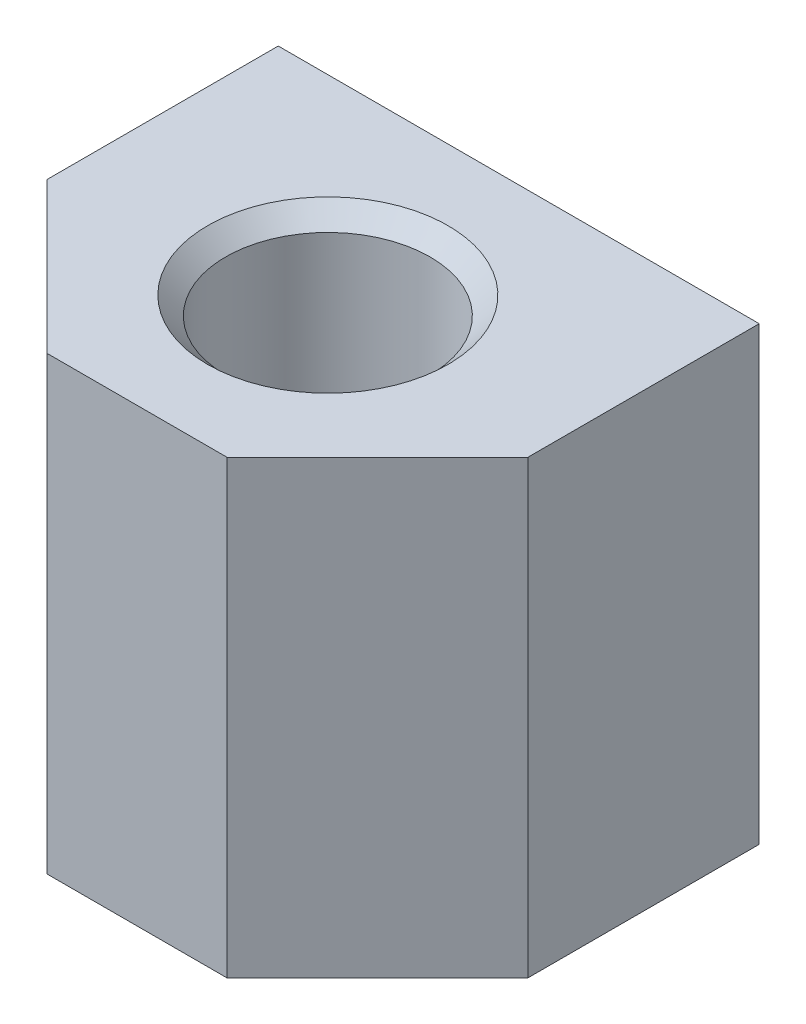
ISO-10303-21;
HEADER;
FILE_DESCRIPTION(('STEP AP214'),'2;1');
FILE_NAME('part.step','',(''),(''),'','','');
FILE_SCHEMA(('AUTOMOTIVE_DESIGN { 1 0 10303 214 1 1 1 1 }'));
ENDSEC;
DATA;
#1=APPLICATION_CONTEXT('core data for automotive mechanical design processes');
#2=APPLICATION_PROTOCOL_DEFINITION('international standard','automotive_design',2000,#1);
#3=PRODUCT_CONTEXT('',#1,'mechanical');
#4=PRODUCT('Part','Part','',(#3));
#5=PRODUCT_RELATED_PRODUCT_CATEGORY('part','',(#4));
#6=PRODUCT_DEFINITION_FORMATION('','',#4);
#7=PRODUCT_DEFINITION_CONTEXT('part definition',#1,'design');
#8=PRODUCT_DEFINITION('design','',#6,#7);
#9=PRODUCT_DEFINITION_SHAPE('','',#8);
#10=(LENGTH_UNIT() NAMED_UNIT(*) SI_UNIT(.MILLI.,.METRE.));
#11=(NAMED_UNIT(*) PLANE_ANGLE_UNIT() SI_UNIT($,.RADIAN.));
#12=(NAMED_UNIT(*) SI_UNIT($,.STERADIAN.) SOLID_ANGLE_UNIT());
#13=UNCERTAINTY_MEASURE_WITH_UNIT(LENGTH_MEASURE(1.E-05),#10,'distance_accuracy_value','');
#14=(GEOMETRIC_REPRESENTATION_CONTEXT(3) GLOBAL_UNCERTAINTY_ASSIGNED_CONTEXT((#13)) GLOBAL_UNIT_ASSIGNED_CONTEXT((#10,
#11,#12)) REPRESENTATION_CONTEXT('',''));
#15=CARTESIAN_POINT('',(0.,0.,0.));
#16=DIRECTION('',(0.,0.,1.));
#17=DIRECTION('',(1.,0.,0.));
#18=AXIS2_PLACEMENT_3D('',#15,#16,#17);
#19=CARTESIAN_POINT('',(-8.,7.5,-6.35));
#20=DIRECTION('',(1.,0.,0.));
#21=DIRECTION('',(0.,0.,-1.));
#22=AXIS2_PLACEMENT_3D('',#19,#20,#21);
#23=PLANE('',#22);
#24=DIRECTION('',(0.,0.,1.));
#25=VECTOR('',#24,1.);
#26=CARTESIAN_POINT('',(-8.,-7.5,-6.35));
#27=LINE('',#26,#25);
#28=CARTESIAN_POINT('',(-8.,-7.5,-6.35));
#29=VERTEX_POINT('',#28);
#30=CARTESIAN_POINT('',(-8.,-7.5,1.34999999999999));
#31=VERTEX_POINT('',#30);
#32=EDGE_CURVE('E136',#29,#31,#27,.T.);
#33=ORIENTED_EDGE('',*,*,#32,.T.);
#34=DIRECTION('',(0.,1.,0.));
#35=VECTOR('',#34,1.);
#36=CARTESIAN_POINT('',(-8.,7.5,1.34999999999999));
#37=LINE('',#36,#35);
#38=CARTESIAN_POINT('',(-8.,7.5,1.34999999999998));
#39=VERTEX_POINT('',#38);
#40=EDGE_CURVE('E61',#31,#39,#37,.T.);
#41=ORIENTED_EDGE('',*,*,#40,.T.);
#42=DIRECTION('',(0.,0.,1.));
#43=VECTOR('',#42,1.);
#44=CARTESIAN_POINT('',(-8.,7.5,-6.35));
#45=LINE('',#44,#43);
#46=CARTESIAN_POINT('',(-8.,7.5,-6.35));
#47=VERTEX_POINT('',#46);
#48=EDGE_CURVE('E137',#47,#39,#45,.T.);
#49=ORIENTED_EDGE('',*,*,#48,.F.);
#50=DIRECTION('',(0.,-1.,0.));
#51=VECTOR('',#50,1.);
#52=CARTESIAN_POINT('',(-8.,7.5,-6.35));
#53=LINE('',#52,#51);
#54=EDGE_CURVE('E146',#47,#29,#53,.T.);
#55=ORIENTED_EDGE('',*,*,#54,.T.);
#56=EDGE_LOOP('',(#33,#41,#49,#55));
#57=FACE_BOUND('',#56,.T.);
#58=ADVANCED_FACE('F38',(#57),#23,.F.);
#59=CARTESIAN_POINT('',(8.,7.5,6.35));
#60=DIRECTION('',(0.,0.,-1.));
#61=DIRECTION('',(-1.,0.,0.));
#62=AXIS2_PLACEMENT_3D('',#59,#60,#61);
#63=PLANE('',#62);
#64=DIRECTION('',(1.,0.,0.));
#65=VECTOR('',#64,1.);
#66=CARTESIAN_POINT('',(8.,7.5,6.35));
#67=LINE('',#66,#65);
#68=CARTESIAN_POINT('',(-3.,7.5,6.35));
#69=VERTEX_POINT('',#68);
#70=CARTESIAN_POINT('',(2.99999999999999,7.5,6.35));
#71=VERTEX_POINT('',#70);
#72=EDGE_CURVE('E139',#69,#71,#67,.T.);
#73=ORIENTED_EDGE('',*,*,#72,.F.);
#74=DIRECTION('',(0.,-1.,0.));
#75=VECTOR('',#74,1.);
#76=CARTESIAN_POINT('',(-3.,7.5,6.35));
#77=LINE('',#76,#75);
#78=CARTESIAN_POINT('',(-3.,-7.5,6.35));
#79=VERTEX_POINT('',#78);
#80=EDGE_CURVE('E161',#69,#79,#77,.T.);
#81=ORIENTED_EDGE('',*,*,#80,.T.);
#82=DIRECTION('',(1.,0.,0.));
#83=VECTOR('',#82,1.);
#84=CARTESIAN_POINT('',(8.,-7.5,6.35));
#85=LINE('',#84,#83);
#86=CARTESIAN_POINT('',(2.99999999999999,-7.5,6.35));
#87=VERTEX_POINT('',#86);
#88=EDGE_CURVE('E148',#79,#87,#85,.T.);
#89=ORIENTED_EDGE('',*,*,#88,.T.);
#90=DIRECTION('',(0.,1.,0.));
#91=VECTOR('',#90,1.);
#92=CARTESIAN_POINT('',(2.99999999999999,7.5,6.35));
#93=LINE('',#92,#91);
#94=EDGE_CURVE('E159',#87,#71,#93,.T.);
#95=ORIENTED_EDGE('',*,*,#94,.T.);
#96=EDGE_LOOP('',(#73,#81,#89,#95));
#97=FACE_BOUND('',#96,.T.);
#98=ADVANCED_FACE('F175',(#97),#63,.F.);
#99=CARTESIAN_POINT('',(8.,7.5,-6.35));
#100=DIRECTION('',(-1.,0.,0.));
#101=DIRECTION('',(0.,0.,1.));
#102=AXIS2_PLACEMENT_3D('',#99,#100,#101);
#103=PLANE('',#102);
#104=DIRECTION('',(0.,0.,-1.));
#105=VECTOR('',#104,1.);
#106=CARTESIAN_POINT('',(8.,7.5,-6.35));
#107=LINE('',#106,#105);
#108=CARTESIAN_POINT('',(8.,7.5,1.35));
#109=VERTEX_POINT('',#108);
#110=CARTESIAN_POINT('',(8.,7.5,-6.35));
#111=VERTEX_POINT('',#110);
#112=EDGE_CURVE('E142',#109,#111,#107,.T.);
#113=ORIENTED_EDGE('',*,*,#112,.F.);
#114=DIRECTION('',(0.,-1.,0.));
#115=VECTOR('',#114,1.);
#116=CARTESIAN_POINT('',(8.,7.5,1.35));
#117=LINE('',#116,#115);
#118=CARTESIAN_POINT('',(8.,-7.5,1.35));
#119=VERTEX_POINT('',#118);
#120=EDGE_CURVE('E11',#109,#119,#117,.T.);
#121=ORIENTED_EDGE('',*,*,#120,.T.);
#122=DIRECTION('',(0.,0.,-1.));
#123=VECTOR('',#122,1.);
#124=CARTESIAN_POINT('',(8.,-7.5,-6.35));
#125=LINE('',#124,#123);
#126=CARTESIAN_POINT('',(8.,-7.5,-6.35));
#127=VERTEX_POINT('',#126);
#128=EDGE_CURVE('E151',#119,#127,#125,.T.);
#129=ORIENTED_EDGE('',*,*,#128,.T.);
#130=DIRECTION('',(0.,-1.,0.));
#131=VECTOR('',#130,1.);
#132=CARTESIAN_POINT('',(8.,7.5,-6.35));
#133=LINE('',#132,#131);
#134=EDGE_CURVE('E156',#111,#127,#133,.T.);
#135=ORIENTED_EDGE('',*,*,#134,.F.);
#136=EDGE_LOOP('',(#113,#121,#129,#135));
#137=FACE_BOUND('',#136,.T.);
#138=ADVANCED_FACE('F190',(#137),#103,.F.);
#139=CARTESIAN_POINT('',(-3.66617420935413,7.5,-6.35));
#140=DIRECTION('',(0.,0.,1.));
#141=DIRECTION('',(1.,0.,0.));
#142=AXIS2_PLACEMENT_3D('',#139,#140,#141);
#143=PLANE('',#142);
#144=CARTESIAN_POINT('',(6.,0.,-6.35));
#145=DIRECTION('',(0.,0.,-1.));
#146=DIRECTION('',(-1.,0.,0.));
#147=AXIS2_PLACEMENT_3D('',#144,#145,#146);
#148=CIRCLE('',#147,1.525);
#149=CARTESIAN_POINT('',(4.475,0.,-6.35));
#150=VERTEX_POINT('',#149);
#151=EDGE_CURVE('E115',#150,#150,#148,.T.);
#152=ORIENTED_EDGE('',*,*,#151,.F.);
#153=EDGE_LOOP('',(#152));
#154=FACE_BOUND('',#153,.T.);
#155=CARTESIAN_POINT('',(-6.,0.,-6.35));
#156=DIRECTION('',(0.,0.,-1.));
#157=DIRECTION('',(-1.,0.,0.));
#158=AXIS2_PLACEMENT_3D('',#155,#156,#157);
#159=CIRCLE('',#158,1.525);
#160=CARTESIAN_POINT('',(-7.525,0.,-6.35));
#161=VERTEX_POINT('',#160);
#162=EDGE_CURVE('E108',#161,#161,#159,.T.);
#163=ORIENTED_EDGE('',*,*,#162,.F.);
#164=EDGE_LOOP('',(#163));
#165=FACE_BOUND('',#164,.T.);
#166=DIRECTION('',(-1.,0.,0.));
#167=VECTOR('',#166,1.);
#168=CARTESIAN_POINT('',(-3.66617420935413,-7.5,-6.35));
#169=LINE('',#168,#167);
#170=EDGE_CURVE('E140',#127,#29,#169,.T.);
#171=ORIENTED_EDGE('',*,*,#170,.T.);
#172=ORIENTED_EDGE('',*,*,#54,.F.);
#173=DIRECTION('',(-1.,0.,0.));
#174=VECTOR('',#173,1.);
#175=CARTESIAN_POINT('',(3.66617420935413,7.5,-6.35));
#176=LINE('',#175,#174);
#177=EDGE_CURVE('E144',#111,#47,#176,.T.);
#178=ORIENTED_EDGE('',*,*,#177,.F.);
#179=ORIENTED_EDGE('',*,*,#134,.T.);
#180=EDGE_LOOP('',(#171,#172,#178,#179));
#181=FACE_BOUND('',#180,.T.);
#182=ADVANCED_FACE('F186',(#154,#165,#181),#143,.F.);
#183=CARTESIAN_POINT('',(0.,7.5,0.));
#184=DIRECTION('',(0.,-1.,0.));
#185=DIRECTION('',(0.,0.,-1.));
#186=AXIS2_PLACEMENT_3D('',#183,#184,#185);
#187=PLANE('',#186);
#188=CARTESIAN_POINT('',(0.,7.5,0.));
#189=DIRECTION('',(0.,1.,0.));
#190=DIRECTION('',(0.,0.,1.));
#191=AXIS2_PLACEMENT_3D('',#188,#189,#190);
#192=CIRCLE('',#191,4.);
#193=CARTESIAN_POINT('',(0.,7.5,4.));
#194=VERTEX_POINT('',#193);
#195=EDGE_CURVE('E127',#194,#194,#192,.T.);
#196=ORIENTED_EDGE('',*,*,#195,.F.);
#197=EDGE_LOOP('',(#196));
#198=FACE_BOUND('',#197,.T.);
#199=ORIENTED_EDGE('',*,*,#48,.T.);
#200=DIRECTION('',(-0.707106781186546,0.,-0.707106781186549));
#201=VECTOR('',#200,1.);
#202=CARTESIAN_POINT('',(-3.,7.5,6.35));
#203=LINE('',#202,#201);
#204=EDGE_CURVE('E46',#39,#69,#203,.F.);
#205=ORIENTED_EDGE('',*,*,#204,.T.);
#206=ORIENTED_EDGE('',*,*,#72,.T.);
#207=DIRECTION('',(-0.707106781186549,0.,0.707106781186546));
#208=VECTOR('',#207,1.);
#209=CARTESIAN_POINT('',(8.,7.5,1.35));
#210=LINE('',#209,#208);
#211=EDGE_CURVE('E53',#71,#109,#210,.F.);
#212=ORIENTED_EDGE('',*,*,#211,.T.);
#213=ORIENTED_EDGE('',*,*,#112,.T.);
#214=ORIENTED_EDGE('',*,*,#177,.T.);
#215=EDGE_LOOP('',(#199,#205,#206,#212,#213,#214));
#216=FACE_BOUND('',#215,.T.);
#217=ADVANCED_FACE('F171',(#198,#216),#187,.F.);
#218=CARTESIAN_POINT('',(0.,-7.5,0.));
#219=DIRECTION('',(0.,-1.,0.));
#220=DIRECTION('',(0.,0.,-1.));
#221=AXIS2_PLACEMENT_3D('',#218,#219,#220);
#222=PLANE('',#221);
#223=CARTESIAN_POINT('',(0.,-7.5,0.));
#224=DIRECTION('',(0.,1.,0.));
#225=DIRECTION('',(0.,0.,1.));
#226=AXIS2_PLACEMENT_3D('',#223,#224,#225);
#227=CIRCLE('',#226,4.);
#228=CARTESIAN_POINT('',(0.,-7.5,4.));
#229=VERTEX_POINT('',#228);
#230=EDGE_CURVE('E124',#229,#229,#227,.T.);
#231=ORIENTED_EDGE('',*,*,#230,.T.);
#232=EDGE_LOOP('',(#231));
#233=FACE_BOUND('',#232,.T.);
#234=ORIENTED_EDGE('',*,*,#88,.F.);
#235=DIRECTION('',(0.707106781186546,0.,0.707106781186549));
#236=VECTOR('',#235,1.);
#237=CARTESIAN_POINT('',(-4.67500000000001,-7.5,4.67499999999999));
#238=LINE('',#237,#236);
#239=EDGE_CURVE('E166',#79,#31,#238,.F.);
#240=ORIENTED_EDGE('',*,*,#239,.T.);
#241=ORIENTED_EDGE('',*,*,#32,.F.);
#242=ORIENTED_EDGE('',*,*,#170,.F.);
#243=ORIENTED_EDGE('',*,*,#128,.F.);
#244=DIRECTION('',(0.707106781186549,0.,-0.707106781186546));
#245=VECTOR('',#244,1.);
#246=CARTESIAN_POINT('',(4.67499999999999,-7.5,4.675));
#247=LINE('',#246,#245);
#248=EDGE_CURVE('E164',#119,#87,#247,.F.);
#249=ORIENTED_EDGE('',*,*,#248,.T.);
#250=EDGE_LOOP('',(#234,#240,#241,#242,#243,#249));
#251=FACE_BOUND('',#250,.T.);
#252=ADVANCED_FACE('F181',(#233,#251),#222,.T.);
#253=CARTESIAN_POINT('',(0.,-6.9,0.));
#254=DIRECTION('',(0.,-1.,0.));
#255=DIRECTION('',(0.,0.,-1.));
#256=AXIS2_PLACEMENT_3D('',#253,#254,#255);
#257=CONICAL_SURFACE('',#256,3.4,0.785398163397446);
#258=ORIENTED_EDGE('',*,*,#230,.F.);
#259=EDGE_LOOP('',(#258));
#260=FACE_BOUND('',#259,.T.);
#261=CARTESIAN_POINT('',(0.,-6.9,0.));
#262=DIRECTION('',(0.,1.,0.));
#263=DIRECTION('',(0.,0.,1.));
#264=AXIS2_PLACEMENT_3D('',#261,#262,#263);
#265=CIRCLE('',#264,3.4);
#266=CARTESIAN_POINT('',(0.,-6.9,3.4));
#267=VERTEX_POINT('',#266);
#268=EDGE_CURVE('E133',#267,#267,#265,.T.);
#269=ORIENTED_EDGE('',*,*,#268,.T.);
#270=EDGE_LOOP('',(#269));
#271=FACE_BOUND('',#270,.T.);
#272=ADVANCED_FACE('F212',(#260,#271),#257,.F.);
#273=CARTESIAN_POINT('',(0.,7.5,0.));
#274=DIRECTION('',(0.,1.,0.));
#275=DIRECTION('',(0.,0.,1.));
#276=AXIS2_PLACEMENT_3D('',#273,#274,#275);
#277=CYLINDRICAL_SURFACE('',#276,3.4);
#278=ORIENTED_EDGE('',*,*,#268,.F.);
#279=EDGE_LOOP('',(#278));
#280=FACE_BOUND('',#279,.T.);
#281=CARTESIAN_POINT('',(0.,6.9,0.));
#282=DIRECTION('',(0.,1.,0.));
#283=DIRECTION('',(0.,0.,1.));
#284=AXIS2_PLACEMENT_3D('',#281,#282,#283);
#285=CIRCLE('',#284,3.4);
#286=CARTESIAN_POINT('',(0.,6.9,3.4));
#287=VERTEX_POINT('',#286);
#288=EDGE_CURVE('E130',#287,#287,#285,.T.);
#289=ORIENTED_EDGE('',*,*,#288,.T.);
#290=EDGE_LOOP('',(#289));
#291=FACE_BOUND('',#290,.T.);
#292=ADVANCED_FACE('F219',(#280,#291),#277,.F.);
#293=CARTESIAN_POINT('',(0.,7.5,0.));
#294=DIRECTION('',(0.,1.,0.));
#295=DIRECTION('',(0.,0.,1.));
#296=AXIS2_PLACEMENT_3D('',#293,#294,#295);
#297=CONICAL_SURFACE('',#296,4.,0.785398163397446);
#298=ORIENTED_EDGE('',*,*,#288,.F.);
#299=EDGE_LOOP('',(#298));
#300=FACE_BOUND('',#299,.T.);
#301=ORIENTED_EDGE('',*,*,#195,.T.);
#302=EDGE_LOOP('',(#301));
#303=FACE_BOUND('',#302,.T.);
#304=ADVANCED_FACE('F223',(#300,#303),#297,.F.);
#305=CARTESIAN_POINT('',(-6.,0.,1.15));
#306=DIRECTION('',(0.,0.,-1.));
#307=DIRECTION('',(-1.,0.,0.));
#308=AXIS2_PLACEMENT_3D('',#305,#306,#307);
#309=CONICAL_SURFACE('',#308,1.25,1.02974425867665);
#310=CARTESIAN_POINT('',(-6.,0.,1.90107577378445));
#311=VERTEX_POINT('',#310);
#312=VERTEX_LOOP('',#311);
#313=FACE_BOUND('',#312,.T.);
#314=CARTESIAN_POINT('',(-6.,0.,1.15));
#315=DIRECTION('',(0.,0.,-1.));
#316=DIRECTION('',(-1.,0.,0.));
#317=AXIS2_PLACEMENT_3D('',#314,#315,#316);
#318=CIRCLE('',#317,1.25);
#319=CARTESIAN_POINT('',(-7.25,0.,1.15));
#320=VERTEX_POINT('',#319);
#321=EDGE_CURVE('E121',#320,#320,#318,.T.);
#322=ORIENTED_EDGE('',*,*,#321,.T.);
#323=EDGE_LOOP('',(#322));
#324=FACE_BOUND('',#323,.T.);
#325=ADVANCED_FACE('F227',(#313,#324),#309,.F.);
#326=CARTESIAN_POINT('',(-6.,0.,-6.35));
#327=DIRECTION('',(0.,0.,-1.));
#328=DIRECTION('',(-1.,0.,0.));
#329=AXIS2_PLACEMENT_3D('',#326,#327,#328);
#330=CYLINDRICAL_SURFACE('',#329,1.25);
#331=ORIENTED_EDGE('',*,*,#321,.F.);
#332=EDGE_LOOP('',(#331));
#333=FACE_BOUND('',#332,.T.);
#334=CARTESIAN_POINT('',(-6.,0.,-6.075));
#335=DIRECTION('',(0.,0.,-1.));
#336=DIRECTION('',(-1.,0.,0.));
#337=AXIS2_PLACEMENT_3D('',#334,#335,#336);
#338=CIRCLE('',#337,1.25);
#339=CARTESIAN_POINT('',(-7.25,0.,-6.075));
#340=VERTEX_POINT('',#339);
#341=EDGE_CURVE('E112',#340,#340,#338,.T.);
#342=ORIENTED_EDGE('',*,*,#341,.T.);
#343=EDGE_LOOP('',(#342));
#344=FACE_BOUND('',#343,.T.);
#345=ADVANCED_FACE('F231',(#333,#344),#330,.F.);
#346=CARTESIAN_POINT('',(-6.,0.,-6.35));
#347=DIRECTION('',(0.,0.,-1.));
#348=DIRECTION('',(-1.,0.,0.));
#349=AXIS2_PLACEMENT_3D('',#346,#347,#348);
#350=CONICAL_SURFACE('',#349,1.525,0.785398163397447);
#351=ORIENTED_EDGE('',*,*,#341,.F.);
#352=EDGE_LOOP('',(#351));
#353=FACE_BOUND('',#352,.T.);
#354=ORIENTED_EDGE('',*,*,#162,.T.);
#355=EDGE_LOOP('',(#354));
#356=FACE_BOUND('',#355,.T.);
#357=ADVANCED_FACE('F102',(#353,#356),#350,.F.);
#358=CARTESIAN_POINT('',(6.,0.,1.15));
#359=DIRECTION('',(0.,0.,-1.));
#360=DIRECTION('',(-1.,0.,0.));
#361=AXIS2_PLACEMENT_3D('',#358,#359,#360);
#362=CONICAL_SURFACE('',#361,1.25,1.02974425867665);
#363=CARTESIAN_POINT('',(6.,0.,1.90107577378445));
#364=VERTEX_POINT('',#363);
#365=VERTEX_LOOP('',#364);
#366=FACE_BOUND('',#365,.T.);
#367=CARTESIAN_POINT('',(6.,0.,1.15));
#368=DIRECTION('',(0.,0.,-1.));
#369=DIRECTION('',(-1.,0.,0.));
#370=AXIS2_PLACEMENT_3D('',#367,#368,#369);
#371=CIRCLE('',#370,1.25);
#372=CARTESIAN_POINT('',(4.75,0.,1.15));
#373=VERTEX_POINT('',#372);
#374=EDGE_CURVE('E106',#373,#373,#371,.T.);
#375=ORIENTED_EDGE('',*,*,#374,.T.);
#376=EDGE_LOOP('',(#375));
#377=FACE_BOUND('',#376,.T.);
#378=ADVANCED_FACE('F98',(#366,#377),#362,.F.);
#379=CARTESIAN_POINT('',(6.,0.,-6.35));
#380=DIRECTION('',(0.,0.,-1.));
#381=DIRECTION('',(-1.,0.,0.));
#382=AXIS2_PLACEMENT_3D('',#379,#380,#381);
#383=CYLINDRICAL_SURFACE('',#382,1.25);
#384=ORIENTED_EDGE('',*,*,#374,.F.);
#385=EDGE_LOOP('',(#384));
#386=FACE_BOUND('',#385,.T.);
#387=CARTESIAN_POINT('',(6.,0.,-6.075));
#388=DIRECTION('',(0.,0.,-1.));
#389=DIRECTION('',(-1.,0.,0.));
#390=AXIS2_PLACEMENT_3D('',#387,#388,#389);
#391=CIRCLE('',#390,1.25);
#392=CARTESIAN_POINT('',(4.75,0.,-6.075));
#393=VERTEX_POINT('',#392);
#394=EDGE_CURVE('E109',#393,#393,#391,.T.);
#395=ORIENTED_EDGE('',*,*,#394,.T.);
#396=EDGE_LOOP('',(#395));
#397=FACE_BOUND('',#396,.T.);
#398=ADVANCED_FACE('F101',(#386,#397),#383,.F.);
#399=CARTESIAN_POINT('',(6.,0.,-6.35));
#400=DIRECTION('',(0.,0.,-1.));
#401=DIRECTION('',(-1.,0.,0.));
#402=AXIS2_PLACEMENT_3D('',#399,#400,#401);
#403=CONICAL_SURFACE('',#402,1.525,0.785398163397447);
#404=ORIENTED_EDGE('',*,*,#394,.F.);
#405=EDGE_LOOP('',(#404));
#406=FACE_BOUND('',#405,.T.);
#407=ORIENTED_EDGE('',*,*,#151,.T.);
#408=EDGE_LOOP('',(#407));
#409=FACE_BOUND('',#408,.T.);
#410=ADVANCED_FACE('F197',(#406,#409),#403,.F.);
#411=CARTESIAN_POINT('',(-3.,7.5,6.35));
#412=DIRECTION('',(0.707106781186549,0.,-0.707106781186546));
#413=DIRECTION('',(0.,-1.,0.));
#414=AXIS2_PLACEMENT_3D('',#411,#412,#413);
#415=PLANE('',#414);
#416=ORIENTED_EDGE('',*,*,#204,.F.);
#417=ORIENTED_EDGE('',*,*,#40,.F.);
#418=ORIENTED_EDGE('',*,*,#239,.F.);
#419=ORIENTED_EDGE('',*,*,#80,.F.);
#420=EDGE_LOOP('',(#416,#417,#418,#419));
#421=FACE_BOUND('',#420,.T.);
#422=ADVANCED_FACE('F178',(#421),#415,.F.);
#423=CARTESIAN_POINT('',(8.,7.5,1.35));
#424=DIRECTION('',(-0.707106781186546,0.,-0.707106781186549));
#425=DIRECTION('',(0.,-1.,0.));
#426=AXIS2_PLACEMENT_3D('',#423,#424,#425);
#427=PLANE('',#426);
#428=ORIENTED_EDGE('',*,*,#211,.F.);
#429=ORIENTED_EDGE('',*,*,#94,.F.);
#430=ORIENTED_EDGE('',*,*,#248,.F.);
#431=ORIENTED_EDGE('',*,*,#120,.F.);
#432=EDGE_LOOP('',(#428,#429,#430,#431));
#433=FACE_BOUND('',#432,.T.);
#434=ADVANCED_FACE('F40',(#433),#427,.F.);
#435=CLOSED_SHELL('',(#58,#98,#138,#182,#217,#252,#272,#292,#304,#325,#345,#357,#378,#398,#410,
#422,#434));
#436=MANIFOLD_SOLID_BREP('B2',#435);
#437=ADVANCED_BREP_SHAPE_REPRESENTATION('',(#18,#436),#14);
#438=SHAPE_DEFINITION_REPRESENTATION(#9,#437);
ENDSEC;
END-ISO-10303-21;
